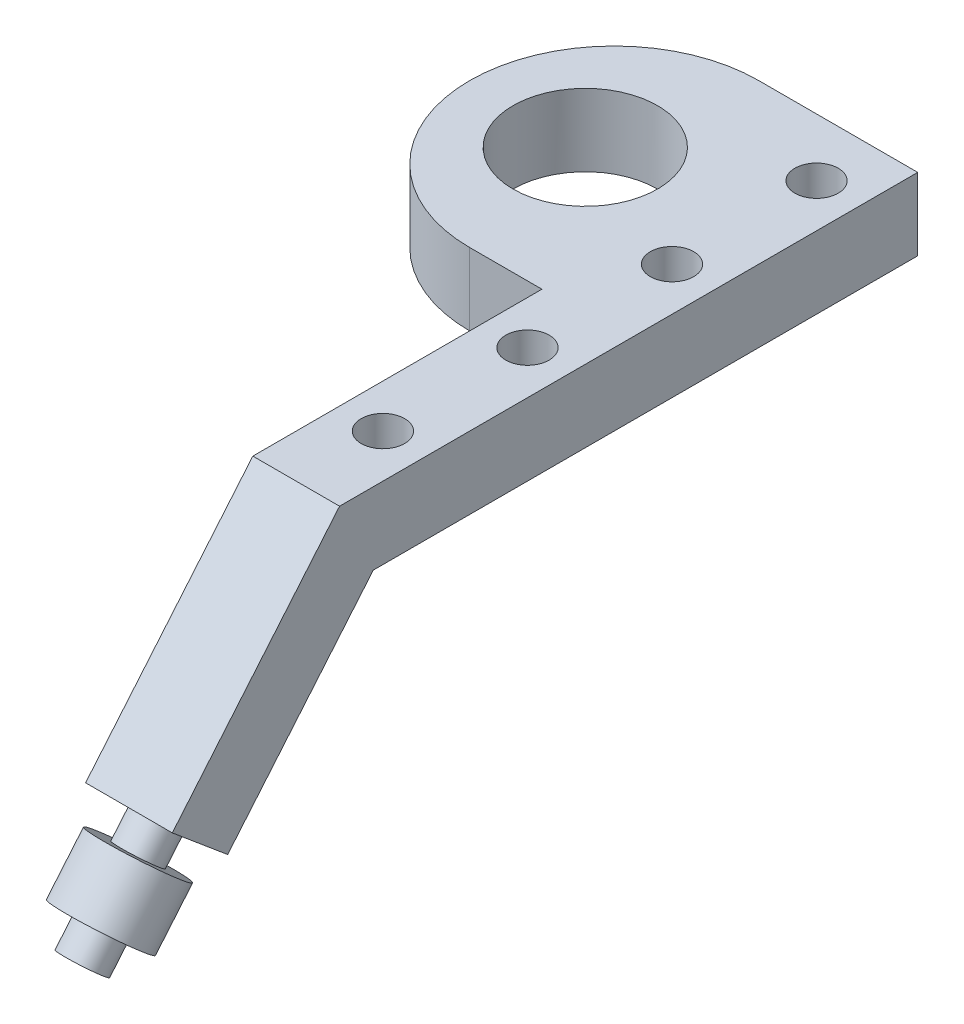
ISO-10303-21;
HEADER;
FILE_DESCRIPTION(('STEP AP214'),'2;1');
FILE_NAME('part.step','',(''),(''),'','','');
FILE_SCHEMA(('AUTOMOTIVE_DESIGN { 1 0 10303 214 1 1 1 1 }'));
ENDSEC;
DATA;
#1=APPLICATION_CONTEXT('core data for automotive mechanical design processes');
#2=APPLICATION_PROTOCOL_DEFINITION('international standard','automotive_design',2000,#1);
#3=PRODUCT_CONTEXT('',#1,'mechanical');
#4=PRODUCT('Part','Part','',(#3));
#5=PRODUCT_RELATED_PRODUCT_CATEGORY('part','',(#4));
#6=PRODUCT_DEFINITION_FORMATION('','',#4);
#7=PRODUCT_DEFINITION_CONTEXT('part definition',#1,'design');
#8=PRODUCT_DEFINITION('design','',#6,#7);
#9=PRODUCT_DEFINITION_SHAPE('','',#8);
#10=(LENGTH_UNIT() NAMED_UNIT(*) SI_UNIT(.MILLI.,.METRE.));
#11=(NAMED_UNIT(*) PLANE_ANGLE_UNIT() SI_UNIT($,.RADIAN.));
#12=(NAMED_UNIT(*) SI_UNIT($,.STERADIAN.) SOLID_ANGLE_UNIT());
#13=UNCERTAINTY_MEASURE_WITH_UNIT(LENGTH_MEASURE(1.E-05),#10,'distance_accuracy_value','');
#14=(GEOMETRIC_REPRESENTATION_CONTEXT(3) GLOBAL_UNCERTAINTY_ASSIGNED_CONTEXT((#13)) GLOBAL_UNIT_ASSIGNED_CONTEXT((#10,
#11,#12)) REPRESENTATION_CONTEXT('',''));
#15=CARTESIAN_POINT('',(0.,0.,0.));
#16=DIRECTION('',(0.,0.,1.));
#17=DIRECTION('',(1.,0.,0.));
#18=AXIS2_PLACEMENT_3D('',#15,#16,#17);
#19=CARTESIAN_POINT('',(0.,5.,0.));
#20=DIRECTION('',(1.,0.,0.));
#21=DIRECTION('',(0.,0.,-1.));
#22=AXIS2_PLACEMENT_3D('',#19,#20,#21);
#23=PLANE('',#22);
#24=DIRECTION('',(0.,1.,0.));
#25=VECTOR('',#24,1.);
#26=CARTESIAN_POINT('',(0.,5.,-20.));
#27=LINE('',#26,#25);
#28=CARTESIAN_POINT('',(0.,0.,-20.));
#29=VERTEX_POINT('',#28);
#30=CARTESIAN_POINT('',(0.,5.,-20.));
#31=VERTEX_POINT('',#30);
#32=EDGE_CURVE('E112',#29,#31,#27,.T.);
#33=ORIENTED_EDGE('',*,*,#32,.F.);
#34=DIRECTION('',(0.,0.,1.));
#35=VECTOR('',#34,1.);
#36=CARTESIAN_POINT('',(0.,0.,0.));
#37=LINE('',#36,#35);
#38=CARTESIAN_POINT('',(0.,0.,-2.33153829077497));
#39=VERTEX_POINT('',#38);
#40=EDGE_CURVE('E187',#29,#39,#37,.T.);
#41=ORIENTED_EDGE('',*,*,#40,.T.);
#42=DIRECTION('',(0.,0.766044443118975,-0.642787609686543));
#43=VECTOR('',#42,1.);
#44=CARTESIAN_POINT('',(0.,-12.0027380245743,7.7399547587629));
#45=LINE('',#44,#43);
#46=CARTESIAN_POINT('',(0.,-12.0027380245743,7.7399547587629));
#47=VERTEX_POINT('',#46);
#48=EDGE_CURVE('E146',#47,#39,#45,.T.);
#49=ORIENTED_EDGE('',*,*,#48,.F.);
#50=DIRECTION('',(0.,-0.642787609686543,-0.766044443118975));
#51=VECTOR('',#50,1.);
#52=CARTESIAN_POINT('',(0.,-8.78879997614155,11.5701769743578));
#53=LINE('',#52,#51);
#54=CARTESIAN_POINT('',(0.,-8.78879997614155,11.5701769743578));
#55=VERTEX_POINT('',#54);
#56=EDGE_CURVE('E153',#55,#47,#53,.T.);
#57=ORIENTED_EDGE('',*,*,#56,.F.);
#58=DIRECTION('',(0.,-0.766044443118975,0.642787609686543));
#59=VECTOR('',#58,1.);
#60=CARTESIAN_POINT('',(0.,5.,0.));
#61=LINE('',#60,#59);
#62=CARTESIAN_POINT('',(0.,5.,0.));
#63=VERTEX_POINT('',#62);
#64=EDGE_CURVE('E119',#63,#55,#61,.T.);
#65=ORIENTED_EDGE('',*,*,#64,.F.);
#66=DIRECTION('',(0.,0.,1.));
#67=VECTOR('',#66,1.);
#68=CARTESIAN_POINT('',(0.,5.,0.));
#69=LINE('',#68,#67);
#70=EDGE_CURVE('E106',#31,#63,#69,.T.);
#71=ORIENTED_EDGE('',*,*,#70,.F.);
#72=EDGE_LOOP('',(#33,#41,#49,#57,#65,#71));
#73=FACE_BOUND('',#72,.T.);
#74=ADVANCED_FACE('F36',(#73),#23,.F.);
#75=CARTESIAN_POINT('',(6.,-8.78879997614155,11.5701769743578));
#76=DIRECTION('',(0.,0.766044443118975,-0.642787609686543));
#77=DIRECTION('',(0.,0.642787609686543,0.766044443118975));
#78=AXIS2_PLACEMENT_3D('',#75,#76,#77);
#79=PLANE('',#78);
#80=ORIENTED_EDGE('',*,*,#56,.T.);
#81=DIRECTION('',(-1.,0.,0.));
#82=VECTOR('',#81,1.);
#83=CARTESIAN_POINT('',(6.,-12.0027380245743,7.7399547587629));
#84=LINE('',#83,#82);
#85=CARTESIAN_POINT('',(6.,-12.0027380245743,7.7399547587629));
#86=VERTEX_POINT('',#85);
#87=EDGE_CURVE('E151',#86,#47,#84,.T.);
#88=ORIENTED_EDGE('',*,*,#87,.F.);
#89=DIRECTION('',(0.,-0.642787609686543,-0.766044443118975));
#90=VECTOR('',#89,1.);
#91=CARTESIAN_POINT('',(6.,-8.78879997614155,11.5701769743578));
#92=LINE('',#91,#90);
#93=CARTESIAN_POINT('',(6.,-8.78879997614155,11.5701769743578));
#94=VERTEX_POINT('',#93);
#95=EDGE_CURVE('E145',#94,#86,#92,.T.);
#96=ORIENTED_EDGE('',*,*,#95,.F.);
#97=DIRECTION('',(-1.,0.,0.));
#98=VECTOR('',#97,1.);
#99=CARTESIAN_POINT('',(6.,-8.78879997614155,11.5701769743578));
#100=LINE('',#99,#98);
#101=EDGE_CURVE('E159',#94,#55,#100,.T.);
#102=ORIENTED_EDGE('',*,*,#101,.T.);
#103=EDGE_LOOP('',(#80,#88,#96,#102));
#104=FACE_BOUND('',#103,.T.);
#105=CARTESIAN_POINT('',(3.,-10.3957690003579,9.65506586656035));
#106=DIRECTION('',(0.,0.766044443118975,-0.642787609686543));
#107=DIRECTION('',(0.,0.642787609686543,0.766044443118975));
#108=AXIS2_PLACEMENT_3D('',#105,#106,#107);
#109=CIRCLE('',#108,1.5);
#110=CARTESIAN_POINT('',(3.,-9.43158758582809,10.8041325312388));
#111=VERTEX_POINT('',#110);
#112=EDGE_CURVE('E202',#111,#111,#109,.F.);
#113=ORIENTED_EDGE('',*,*,#112,.F.);
#114=EDGE_LOOP('',(#113));
#115=FACE_BOUND('',#114,.T.);
#116=ADVANCED_FACE('F270',(#104,#115),#79,.F.);
#117=CARTESIAN_POINT('',(0.,0.,0.));
#118=DIRECTION('',(0.,-1.,0.));
#119=DIRECTION('',(0.,0.,-1.));
#120=AXIS2_PLACEMENT_3D('',#117,#118,#119);
#121=PLANE('',#120);
#122=CARTESIAN_POINT('',(-7.,0.,-30.));
#123=DIRECTION('',(0.,-1.,0.));
#124=DIRECTION('',(0.,0.,-1.));
#125=AXIS2_PLACEMENT_3D('',#122,#123,#124);
#126=CIRCLE('',#125,5.);
#127=CARTESIAN_POINT('',(-7.,0.,-35.));
#128=VERTEX_POINT('',#127);
#129=EDGE_CURVE('E128',#128,#128,#126,.F.);
#130=ORIENTED_EDGE('',*,*,#129,.T.);
#131=EDGE_LOOP('',(#130));
#132=FACE_BOUND('',#131,.T.);
#133=CARTESIAN_POINT('',(3.,0.,-36.));
#134=DIRECTION('',(0.,1.,0.));
#135=DIRECTION('',(0.,0.,1.));
#136=AXIS2_PLACEMENT_3D('',#133,#134,#135);
#137=CIRCLE('',#136,1.5);
#138=CARTESIAN_POINT('',(3.,0.,-34.5));
#139=VERTEX_POINT('',#138);
#140=EDGE_CURVE('E168',#139,#139,#137,.T.);
#141=ORIENTED_EDGE('',*,*,#140,.T.);
#142=EDGE_LOOP('',(#141));
#143=FACE_BOUND('',#142,.T.);
#144=CARTESIAN_POINT('',(3.,0.,-16.));
#145=DIRECTION('',(0.,1.,0.));
#146=DIRECTION('',(0.,0.,1.));
#147=AXIS2_PLACEMENT_3D('',#144,#145,#146);
#148=CIRCLE('',#147,1.5);
#149=CARTESIAN_POINT('',(3.,0.,-14.5));
#150=VERTEX_POINT('',#149);
#151=EDGE_CURVE('E180',#150,#150,#148,.T.);
#152=ORIENTED_EDGE('',*,*,#151,.T.);
#153=EDGE_LOOP('',(#152));
#154=FACE_BOUND('',#153,.T.);
#155=CARTESIAN_POINT('',(3.,0.,-6.));
#156=DIRECTION('',(0.,1.,0.));
#157=DIRECTION('',(0.,0.,1.));
#158=AXIS2_PLACEMENT_3D('',#155,#156,#157);
#159=CIRCLE('',#158,1.5);
#160=CARTESIAN_POINT('',(3.,0.,-4.5));
#161=VERTEX_POINT('',#160);
#162=EDGE_CURVE('E183',#161,#161,#159,.T.);
#163=ORIENTED_EDGE('',*,*,#162,.T.);
#164=EDGE_LOOP('',(#163));
#165=FACE_BOUND('',#164,.T.);
#166=CARTESIAN_POINT('',(3.,0.,-26.));
#167=DIRECTION('',(0.,1.,0.));
#168=DIRECTION('',(0.,0.,1.));
#169=AXIS2_PLACEMENT_3D('',#166,#167,#168);
#170=CIRCLE('',#169,1.5);
#171=CARTESIAN_POINT('',(3.,0.,-24.5));
#172=VERTEX_POINT('',#171);
#173=EDGE_CURVE('E174',#172,#172,#170,.T.);
#174=ORIENTED_EDGE('',*,*,#173,.T.);
#175=EDGE_LOOP('',(#174));
#176=FACE_BOUND('',#175,.T.);
#177=CARTESIAN_POINT('',(-5.,0.,-30.));
#178=DIRECTION('',(0.,-1.,0.));
#179=DIRECTION('',(0.,0.,-1.));
#180=AXIS2_PLACEMENT_3D('',#177,#178,#179);
#181=CIRCLE('',#180,10.);
#182=CARTESIAN_POINT('',(-5.,0.,-20.));
#183=VERTEX_POINT('',#182);
#184=CARTESIAN_POINT('',(-15.,0.,-30.));
#185=VERTEX_POINT('',#184);
#186=EDGE_CURVE('E205',#183,#185,#181,.T.);
#187=ORIENTED_EDGE('',*,*,#186,.T.);
#188=CARTESIAN_POINT('',(-5.,0.,-30.));
#189=DIRECTION('',(0.,-1.,0.));
#190=DIRECTION('',(0.,0.,-1.));
#191=AXIS2_PLACEMENT_3D('',#188,#189,#190);
#192=CIRCLE('',#191,10.);
#193=CARTESIAN_POINT('',(-5.,0.,-40.));
#194=VERTEX_POINT('',#193);
#195=EDGE_CURVE('E223',#185,#194,#192,.T.);
#196=ORIENTED_EDGE('',*,*,#195,.T.);
#197=DIRECTION('',(-1.,0.,0.));
#198=VECTOR('',#197,1.);
#199=CARTESIAN_POINT('',(0.,0.,-40.));
#200=LINE('',#199,#198);
#201=CARTESIAN_POINT('',(6.,0.,-40.));
#202=VERTEX_POINT('',#201);
#203=EDGE_CURVE('E121',#202,#194,#200,.T.);
#204=ORIENTED_EDGE('',*,*,#203,.F.);
#205=DIRECTION('',(0.,0.,-1.));
#206=VECTOR('',#205,1.);
#207=CARTESIAN_POINT('',(6.,0.,0.));
#208=LINE('',#207,#206);
#209=CARTESIAN_POINT('',(6.,0.,-2.33153829077497));
#210=VERTEX_POINT('',#209);
#211=EDGE_CURVE('E199',#210,#202,#208,.T.);
#212=ORIENTED_EDGE('',*,*,#211,.F.);
#213=DIRECTION('',(-1.,0.,0.));
#214=VECTOR('',#213,1.);
#215=CARTESIAN_POINT('',(0.,0.,-2.33153829077497));
#216=LINE('',#215,#214);
#217=EDGE_CURVE('E162',#210,#39,#216,.T.);
#218=ORIENTED_EDGE('',*,*,#217,.T.);
#219=ORIENTED_EDGE('',*,*,#40,.F.);
#220=DIRECTION('',(1.,0.,0.));
#221=VECTOR('',#220,1.);
#222=CARTESIAN_POINT('',(-15.,0.,-20.));
#223=LINE('',#222,#221);
#224=EDGE_CURVE('E111',#183,#29,#223,.T.);
#225=ORIENTED_EDGE('',*,*,#224,.F.);
#226=EDGE_LOOP('',(#187,#196,#204,#212,#218,#219,#225));
#227=FACE_BOUND('',#226,.T.);
#228=ADVANCED_FACE('F221',(#132,#143,#154,#165,#176,#227),#121,.T.);
#229=CARTESIAN_POINT('',(0.,5.,0.));
#230=DIRECTION('',(0.,-1.,0.));
#231=DIRECTION('',(0.,0.,-1.));
#232=AXIS2_PLACEMENT_3D('',#229,#230,#231);
#233=PLANE('',#232);
#234=CARTESIAN_POINT('',(-7.,5.,-30.));
#235=DIRECTION('',(0.,1.,0.));
#236=DIRECTION('',(0.,0.,1.));
#237=AXIS2_PLACEMENT_3D('',#234,#235,#236);
#238=CIRCLE('',#237,5.);
#239=CARTESIAN_POINT('',(-7.,5.,-25.));
#240=VERTEX_POINT('',#239);
#241=EDGE_CURVE('E125',#240,#240,#238,.T.);
#242=ORIENTED_EDGE('',*,*,#241,.F.);
#243=EDGE_LOOP('',(#242));
#244=FACE_BOUND('',#243,.T.);
#245=CARTESIAN_POINT('',(3.,5.,-26.));
#246=DIRECTION('',(0.,1.,0.));
#247=DIRECTION('',(0.,0.,1.));
#248=AXIS2_PLACEMENT_3D('',#245,#246,#247);
#249=CIRCLE('',#248,1.5);
#250=CARTESIAN_POINT('',(3.,5.,-24.5));
#251=VERTEX_POINT('',#250);
#252=EDGE_CURVE('E171',#251,#251,#249,.T.);
#253=ORIENTED_EDGE('',*,*,#252,.F.);
#254=EDGE_LOOP('',(#253));
#255=FACE_BOUND('',#254,.T.);
#256=CARTESIAN_POINT('',(3.,5.,-6.));
#257=DIRECTION('',(0.,1.,0.));
#258=DIRECTION('',(0.,0.,1.));
#259=AXIS2_PLACEMENT_3D('',#256,#257,#258);
#260=CIRCLE('',#259,1.5);
#261=CARTESIAN_POINT('',(3.,5.,-4.5));
#262=VERTEX_POINT('',#261);
#263=EDGE_CURVE('E184',#262,#262,#260,.T.);
#264=ORIENTED_EDGE('',*,*,#263,.F.);
#265=EDGE_LOOP('',(#264));
#266=FACE_BOUND('',#265,.T.);
#267=DIRECTION('',(-1.,0.,0.));
#268=VECTOR('',#267,1.);
#269=CARTESIAN_POINT('',(0.,5.,-40.));
#270=LINE('',#269,#268);
#271=CARTESIAN_POINT('',(6.,5.,-40.));
#272=VERTEX_POINT('',#271);
#273=CARTESIAN_POINT('',(-5.,5.,-40.));
#274=VERTEX_POINT('',#273);
#275=EDGE_CURVE('E194',#272,#274,#270,.T.);
#276=ORIENTED_EDGE('',*,*,#275,.T.);
#277=CARTESIAN_POINT('',(-5.,5.,-30.));
#278=DIRECTION('',(0.,-1.,0.));
#279=DIRECTION('',(0.,0.,-1.));
#280=AXIS2_PLACEMENT_3D('',#277,#278,#279);
#281=CIRCLE('',#280,10.);
#282=CARTESIAN_POINT('',(-15.,5.,-30.));
#283=VERTEX_POINT('',#282);
#284=EDGE_CURVE('E56',#274,#283,#281,.F.);
#285=ORIENTED_EDGE('',*,*,#284,.T.);
#286=CARTESIAN_POINT('',(-5.,5.,-30.));
#287=DIRECTION('',(0.,-1.,0.));
#288=DIRECTION('',(0.,0.,-1.));
#289=AXIS2_PLACEMENT_3D('',#286,#287,#288);
#290=CIRCLE('',#289,10.);
#291=CARTESIAN_POINT('',(-5.,5.,-20.));
#292=VERTEX_POINT('',#291);
#293=EDGE_CURVE('E51',#283,#292,#290,.F.);
#294=ORIENTED_EDGE('',*,*,#293,.T.);
#295=DIRECTION('',(1.,0.,0.));
#296=VECTOR('',#295,1.);
#297=CARTESIAN_POINT('',(-15.,5.,-20.));
#298=LINE('',#297,#296);
#299=EDGE_CURVE('E102',#292,#31,#298,.T.);
#300=ORIENTED_EDGE('',*,*,#299,.T.);
#301=ORIENTED_EDGE('',*,*,#70,.T.);
#302=DIRECTION('',(1.,0.,0.));
#303=VECTOR('',#302,1.);
#304=CARTESIAN_POINT('',(0.,5.,0.));
#305=LINE('',#304,#303);
#306=CARTESIAN_POINT('',(6.,5.,0.));
#307=VERTEX_POINT('',#306);
#308=EDGE_CURVE('E120',#63,#307,#305,.T.);
#309=ORIENTED_EDGE('',*,*,#308,.T.);
#310=DIRECTION('',(0.,0.,-1.));
#311=VECTOR('',#310,1.);
#312=CARTESIAN_POINT('',(6.,5.,0.));
#313=LINE('',#312,#311);
#314=EDGE_CURVE('E192',#307,#272,#313,.T.);
#315=ORIENTED_EDGE('',*,*,#314,.T.);
#316=EDGE_LOOP('',(#276,#285,#294,#300,#301,#309,#315));
#317=FACE_BOUND('',#316,.T.);
#318=CARTESIAN_POINT('',(3.,5.,-16.));
#319=DIRECTION('',(0.,1.,0.));
#320=DIRECTION('',(0.,0.,1.));
#321=AXIS2_PLACEMENT_3D('',#318,#319,#320);
#322=CIRCLE('',#321,1.5);
#323=CARTESIAN_POINT('',(3.,5.,-14.5));
#324=VERTEX_POINT('',#323);
#325=EDGE_CURVE('E177',#324,#324,#322,.T.);
#326=ORIENTED_EDGE('',*,*,#325,.F.);
#327=EDGE_LOOP('',(#326));
#328=FACE_BOUND('',#327,.T.);
#329=CARTESIAN_POINT('',(3.,5.,-36.));
#330=DIRECTION('',(0.,1.,0.));
#331=DIRECTION('',(0.,0.,1.));
#332=AXIS2_PLACEMENT_3D('',#329,#330,#331);
#333=CIRCLE('',#332,1.5);
#334=CARTESIAN_POINT('',(3.,5.,-34.5));
#335=VERTEX_POINT('',#334);
#336=EDGE_CURVE('E165',#335,#335,#333,.T.);
#337=ORIENTED_EDGE('',*,*,#336,.F.);
#338=EDGE_LOOP('',(#337));
#339=FACE_BOUND('',#338,.T.);
#340=ADVANCED_FACE('F104',(#244,#255,#266,#317,#328,#339),#233,.F.);
#341=CARTESIAN_POINT('',(6.,5.,0.));
#342=DIRECTION('',(-1.,0.,0.));
#343=DIRECTION('',(0.,0.,1.));
#344=AXIS2_PLACEMENT_3D('',#341,#342,#343);
#345=PLANE('',#344);
#346=DIRECTION('',(0.,0.766044443118975,-0.642787609686543));
#347=VECTOR('',#346,1.);
#348=CARTESIAN_POINT('',(6.,-12.0027380245743,7.7399547587629));
#349=LINE('',#348,#347);
#350=EDGE_CURVE('E148',#86,#210,#349,.T.);
#351=ORIENTED_EDGE('',*,*,#350,.T.);
#352=ORIENTED_EDGE('',*,*,#211,.T.);
#353=DIRECTION('',(0.,-1.,0.));
#354=VECTOR('',#353,1.);
#355=CARTESIAN_POINT('',(6.,5.,-40.));
#356=LINE('',#355,#354);
#357=EDGE_CURVE('E196',#272,#202,#356,.T.);
#358=ORIENTED_EDGE('',*,*,#357,.F.);
#359=ORIENTED_EDGE('',*,*,#314,.F.);
#360=DIRECTION('',(0.,-0.766044443118975,0.642787609686543));
#361=VECTOR('',#360,1.);
#362=CARTESIAN_POINT('',(6.,5.,0.));
#363=LINE('',#362,#361);
#364=EDGE_CURVE('E142',#307,#94,#363,.T.);
#365=ORIENTED_EDGE('',*,*,#364,.T.);
#366=ORIENTED_EDGE('',*,*,#95,.T.);
#367=EDGE_LOOP('',(#351,#352,#358,#359,#365,#366));
#368=FACE_BOUND('',#367,.T.);
#369=ADVANCED_FACE('F214',(#368),#345,.F.);
#370=CARTESIAN_POINT('',(0.,5.,-40.));
#371=DIRECTION('',(0.,0.,1.));
#372=DIRECTION('',(1.,0.,0.));
#373=AXIS2_PLACEMENT_3D('',#370,#371,#372);
#374=PLANE('',#373);
#375=ORIENTED_EDGE('',*,*,#203,.T.);
#376=DIRECTION('',(0.,-1.,0.));
#377=VECTOR('',#376,1.);
#378=CARTESIAN_POINT('',(-5.,5.,-40.));
#379=LINE('',#378,#377);
#380=EDGE_CURVE('E228',#194,#274,#379,.F.);
#381=ORIENTED_EDGE('',*,*,#380,.T.);
#382=ORIENTED_EDGE('',*,*,#275,.F.);
#383=ORIENTED_EDGE('',*,*,#357,.T.);
#384=EDGE_LOOP('',(#375,#381,#382,#383));
#385=FACE_BOUND('',#384,.T.);
#386=ADVANCED_FACE('F220',(#385),#374,.F.);
#387=CARTESIAN_POINT('',(3.,5.,-6.));
#388=DIRECTION('',(0.,-1.,0.));
#389=DIRECTION('',(0.,0.,-1.));
#390=AXIS2_PLACEMENT_3D('',#387,#388,#389);
#391=CYLINDRICAL_SURFACE('',#390,1.5);
#392=ORIENTED_EDGE('',*,*,#263,.T.);
#393=EDGE_LOOP('',(#392));
#394=FACE_BOUND('',#393,.T.);
#395=ORIENTED_EDGE('',*,*,#162,.F.);
#396=EDGE_LOOP('',(#395));
#397=FACE_BOUND('',#396,.T.);
#398=ADVANCED_FACE('F319',(#394,#397),#391,.F.);
#399=CARTESIAN_POINT('',(3.,5.,-16.));
#400=DIRECTION('',(0.,-1.,0.));
#401=DIRECTION('',(0.,0.,-1.));
#402=AXIS2_PLACEMENT_3D('',#399,#400,#401);
#403=CYLINDRICAL_SURFACE('',#402,1.5);
#404=ORIENTED_EDGE('',*,*,#325,.T.);
#405=EDGE_LOOP('',(#404));
#406=FACE_BOUND('',#405,.T.);
#407=ORIENTED_EDGE('',*,*,#151,.F.);
#408=EDGE_LOOP('',(#407));
#409=FACE_BOUND('',#408,.T.);
#410=ADVANCED_FACE('F315',(#406,#409),#403,.F.);
#411=CARTESIAN_POINT('',(3.,5.,-26.));
#412=DIRECTION('',(0.,-1.,0.));
#413=DIRECTION('',(0.,0.,-1.));
#414=AXIS2_PLACEMENT_3D('',#411,#412,#413);
#415=CYLINDRICAL_SURFACE('',#414,1.5);
#416=ORIENTED_EDGE('',*,*,#252,.T.);
#417=EDGE_LOOP('',(#416));
#418=FACE_BOUND('',#417,.T.);
#419=ORIENTED_EDGE('',*,*,#173,.F.);
#420=EDGE_LOOP('',(#419));
#421=FACE_BOUND('',#420,.T.);
#422=ADVANCED_FACE('F311',(#418,#421),#415,.F.);
#423=CARTESIAN_POINT('',(3.,5.,-36.));
#424=DIRECTION('',(0.,-1.,0.));
#425=DIRECTION('',(0.,0.,-1.));
#426=AXIS2_PLACEMENT_3D('',#423,#424,#425);
#427=CYLINDRICAL_SURFACE('',#426,1.5);
#428=ORIENTED_EDGE('',*,*,#336,.T.);
#429=EDGE_LOOP('',(#428));
#430=FACE_BOUND('',#429,.T.);
#431=ORIENTED_EDGE('',*,*,#140,.F.);
#432=EDGE_LOOP('',(#431));
#433=FACE_BOUND('',#432,.T.);
#434=ADVANCED_FACE('F306',(#430,#433),#427,.F.);
#435=CARTESIAN_POINT('',(6.,5.,0.));
#436=DIRECTION('',(0.,-0.642787609686543,-0.766044443118975));
#437=DIRECTION('',(0.,0.766044443118975,-0.642787609686543));
#438=AXIS2_PLACEMENT_3D('',#435,#436,#437);
#439=PLANE('',#438);
#440=ORIENTED_EDGE('',*,*,#64,.T.);
#441=ORIENTED_EDGE('',*,*,#101,.F.);
#442=ORIENTED_EDGE('',*,*,#364,.F.);
#443=ORIENTED_EDGE('',*,*,#308,.F.);
#444=EDGE_LOOP('',(#440,#441,#442,#443));
#445=FACE_BOUND('',#444,.T.);
#446=ADVANCED_FACE('F291',(#445),#439,.F.);
#447=CARTESIAN_POINT('',(6.,-12.0027380245743,7.7399547587629));
#448=DIRECTION('',(0.,0.642787609686543,0.766044443118975));
#449=DIRECTION('',(0.,-0.766044443118975,0.642787609686543));
#450=AXIS2_PLACEMENT_3D('',#447,#448,#449);
#451=PLANE('',#450);
#452=ORIENTED_EDGE('',*,*,#217,.F.);
#453=ORIENTED_EDGE('',*,*,#350,.F.);
#454=ORIENTED_EDGE('',*,*,#87,.T.);
#455=ORIENTED_EDGE('',*,*,#48,.T.);
#456=EDGE_LOOP('',(#452,#453,#454,#455));
#457=FACE_BOUND('',#456,.T.);
#458=ADVANCED_FACE('F296',(#457),#451,.F.);
#459=CARTESIAN_POINT('',(3.,-16.5241245453097,14.7973667440527));
#460=DIRECTION('',(0.,0.766044443118975,-0.642787609686543));
#461=DIRECTION('',(0.,0.642787609686543,0.766044443118975));
#462=AXIS2_PLACEMENT_3D('',#459,#460,#461);
#463=CYLINDRICAL_SURFACE('',#462,1.5);
#464=CARTESIAN_POINT('',(3.,-11.9278578865959,10.9406410859334));
#465=DIRECTION('',(3.30886706922939E-11,0.76604444277835,-0.642787610092484));
#466=DIRECTION('',(0.,0.642787610092484,0.766044442778351));
#467=AXIS2_PLACEMENT_3D('',#464,#465,#466);
#468=CIRCLE('',#467,1.5);
#469=CARTESIAN_POINT('',(3.,-10.9636764714571,12.089707750101));
#470=VERTEX_POINT('',#469);
#471=EDGE_CURVE('E238',#470,#470,#468,.T.);
#472=ORIENTED_EDGE('',*,*,#471,.T.);
#473=EDGE_LOOP('',(#472));
#474=FACE_BOUND('',#473,.T.);
#475=ORIENTED_EDGE('',*,*,#112,.T.);
#476=EDGE_LOOP('',(#475));
#477=FACE_BOUND('',#476,.T.);
#478=ADVANCED_FACE('F299',(#474,#477),#463,.T.);
#479=CARTESIAN_POINT('',(-15.,5.,-20.));
#480=DIRECTION('',(0.,0.,-1.));
#481=DIRECTION('',(-1.,0.,0.));
#482=AXIS2_PLACEMENT_3D('',#479,#480,#481);
#483=PLANE('',#482);
#484=ORIENTED_EDGE('',*,*,#299,.F.);
#485=DIRECTION('',(0.,1.,0.));
#486=VECTOR('',#485,1.);
#487=CARTESIAN_POINT('',(-5.,0.,-20.));
#488=LINE('',#487,#486);
#489=EDGE_CURVE('E44',#292,#183,#488,.F.);
#490=ORIENTED_EDGE('',*,*,#489,.T.);
#491=ORIENTED_EDGE('',*,*,#224,.T.);
#492=ORIENTED_EDGE('',*,*,#32,.T.);
#493=EDGE_LOOP('',(#484,#490,#491,#492));
#494=FACE_BOUND('',#493,.T.);
#495=ADVANCED_FACE('F123',(#494),#483,.F.);
#496=CARTESIAN_POINT('',(-7.,-17.4893059598395,-30.));
#497=DIRECTION('',(0.,1.,0.));
#498=DIRECTION('',(0.,0.,1.));
#499=AXIS2_PLACEMENT_3D('',#496,#497,#498);
#500=CYLINDRICAL_SURFACE('',#499,5.);
#501=ORIENTED_EDGE('',*,*,#129,.F.);
#502=EDGE_LOOP('',(#501));
#503=FACE_BOUND('',#502,.T.);
#504=ORIENTED_EDGE('',*,*,#241,.T.);
#505=EDGE_LOOP('',(#504));
#506=FACE_BOUND('',#505,.T.);
#507=ADVANCED_FACE('F286',(#503,#506),#500,.F.);
#508=CARTESIAN_POINT('',(-5.,0.,-30.));
#509=DIRECTION('',(0.,-1.,0.));
#510=DIRECTION('',(0.,0.,-1.));
#511=AXIS2_PLACEMENT_3D('',#508,#509,#510);
#512=CYLINDRICAL_SURFACE('',#511,10.);
#513=ORIENTED_EDGE('',*,*,#489,.F.);
#514=ORIENTED_EDGE('',*,*,#293,.F.);
#515=DIRECTION('',(0.,1.,0.));
#516=VECTOR('',#515,1.);
#517=CARTESIAN_POINT('',(-15.,5.,-30.));
#518=LINE('',#517,#516);
#519=EDGE_CURVE('E237',#185,#283,#518,.T.);
#520=ORIENTED_EDGE('',*,*,#519,.F.);
#521=ORIENTED_EDGE('',*,*,#186,.F.);
#522=EDGE_LOOP('',(#513,#514,#520,#521));
#523=FACE_BOUND('',#522,.T.);
#524=ADVANCED_FACE('F38',(#523),#512,.T.);
#525=CARTESIAN_POINT('',(-5.,0.,-30.));
#526=DIRECTION('',(0.,1.,0.));
#527=DIRECTION('',(0.,0.,1.));
#528=AXIS2_PLACEMENT_3D('',#525,#526,#527);
#529=CYLINDRICAL_SURFACE('',#528,10.);
#530=ORIENTED_EDGE('',*,*,#284,.F.);
#531=ORIENTED_EDGE('',*,*,#380,.F.);
#532=ORIENTED_EDGE('',*,*,#195,.F.);
#533=ORIENTED_EDGE('',*,*,#519,.T.);
#534=EDGE_LOOP('',(#530,#531,#532,#533));
#535=FACE_BOUND('',#534,.T.);
#536=ADVANCED_FACE('F279',(#535),#529,.T.);
#537=CARTESIAN_POINT('',(-6.67391135054161E-10,-15.4509461840316,12.9648832583136));
#538=DIRECTION('',(3.30886706922939E-11,0.76604444277835,-0.642787610092484));
#539=DIRECTION('',(0.,0.642787610092484,0.766044442778351));
#540=AXIS2_PLACEMENT_3D('',#537,#538,#539);
#541=PLANE('',#540);
#542=CARTESIAN_POINT('',(3.,-14.9920356590718,13.5117915246796));
#543=DIRECTION('',(0.,-0.766044443118975,0.642787609686543));
#544=DIRECTION('',(0.,-0.642787609686543,-0.766044443118975));
#545=AXIS2_PLACEMENT_3D('',#542,#543,#544);
#546=CIRCLE('',#545,3.);
#547=CARTESIAN_POINT('',(3.,-16.9203984881314,11.2136581953227));
#548=VERTEX_POINT('',#547);
#549=EDGE_CURVE('E244',#548,#548,#546,.T.);
#550=ORIENTED_EDGE('',*,*,#549,.T.);
#551=EDGE_LOOP('',(#550));
#552=FACE_BOUND('',#551,.T.);
#553=CARTESIAN_POINT('',(3.,-14.9920356590718,13.5117915246796));
#554=DIRECTION('',(3.30886706922939E-11,0.76604444277835,-0.642787610092484));
#555=DIRECTION('',(0.,0.642787610092484,0.766044442778351));
#556=AXIS2_PLACEMENT_3D('',#553,#554,#555);
#557=CIRCLE('',#556,1.5);
#558=CARTESIAN_POINT('',(3.,-14.027854243933,14.6608581888471));
#559=VERTEX_POINT('',#558);
#560=EDGE_CURVE('E12',#559,#559,#557,.T.);
#561=ORIENTED_EDGE('',*,*,#560,.T.);
#562=EDGE_LOOP('',(#561));
#563=FACE_BOUND('',#562,.T.);
#564=ADVANCED_FACE('F252',(#552,#563),#541,.F.);
#565=CARTESIAN_POINT('',(-6.67391135054161E-10,-12.3867684115557,10.3937328195675));
#566=DIRECTION('',(3.30886706922939E-11,0.76604444277835,-0.642787610092484));
#567=DIRECTION('',(0.,0.642787610092484,0.766044442778351));
#568=AXIS2_PLACEMENT_3D('',#565,#566,#567);
#569=PLANE('',#568);
#570=CARTESIAN_POINT('',(3.,-11.9278578865959,10.9406410859334));
#571=DIRECTION('',(0.,-0.766044443118975,0.642787609686543));
#572=DIRECTION('',(0.,-0.642787609686543,-0.766044443118975));
#573=AXIS2_PLACEMENT_3D('',#570,#571,#572);
#574=CIRCLE('',#573,3.);
#575=CARTESIAN_POINT('',(3.,-13.8562207156555,8.64250775657651));
#576=VERTEX_POINT('',#575);
#577=EDGE_CURVE('E240',#576,#576,#574,.T.);
#578=ORIENTED_EDGE('',*,*,#577,.F.);
#579=EDGE_LOOP('',(#578));
#580=FACE_BOUND('',#579,.T.);
#581=ORIENTED_EDGE('',*,*,#471,.F.);
#582=EDGE_LOOP('',(#581));
#583=FACE_BOUND('',#582,.T.);
#584=ADVANCED_FACE('F258',(#580,#583),#569,.T.);
#585=CARTESIAN_POINT('',(3.,-14.9920356590718,13.5117915246796));
#586=DIRECTION('',(0.,0.766044443118975,-0.642787609686543));
#587=DIRECTION('',(0.,0.642787609686543,0.766044443118975));
#588=AXIS2_PLACEMENT_3D('',#585,#586,#587);
#589=CYLINDRICAL_SURFACE('',#588,3.);
#590=ORIENTED_EDGE('',*,*,#549,.F.);
#591=EDGE_LOOP('',(#590));
#592=FACE_BOUND('',#591,.T.);
#593=ORIENTED_EDGE('',*,*,#577,.T.);
#594=EDGE_LOOP('',(#593));
#595=FACE_BOUND('',#594,.T.);
#596=ADVANCED_FACE('F255',(#592,#595),#589,.T.);
#597=CARTESIAN_POINT('',(3.,-16.5241245453097,14.7973667440527));
#598=DIRECTION('',(0.,-0.766044443118975,0.642787609686543));
#599=DIRECTION('',(0.,-0.642787609686543,-0.766044443118975));
#600=AXIS2_PLACEMENT_3D('',#597,#598,#599);
#601=PLANE('',#600);
#602=CARTESIAN_POINT('',(3.,-16.5241245453097,14.7973667440527));
#603=DIRECTION('',(0.,-0.766044443118975,0.642787609686543));
#604=DIRECTION('',(0.,-0.642787609686543,-0.766044443118975));
#605=AXIS2_PLACEMENT_3D('',#602,#603,#604);
#606=CIRCLE('',#605,1.5);
#607=CARTESIAN_POINT('',(3.,-17.4883059598395,13.6483000793742));
#608=VERTEX_POINT('',#607);
#609=EDGE_CURVE('E139',#608,#608,#606,.T.);
#610=ORIENTED_EDGE('',*,*,#609,.T.);
#611=EDGE_LOOP('',(#610));
#612=FACE_BOUND('',#611,.T.);
#613=ADVANCED_FACE('F257',(#612),#601,.T.);
#614=ORIENTED_EDGE('',*,*,#609,.F.);
#615=EDGE_LOOP('',(#614));
#616=FACE_BOUND('',#615,.T.);
#617=ORIENTED_EDGE('',*,*,#560,.F.);
#618=EDGE_LOOP('',(#617));
#619=FACE_BOUND('',#618,.T.);
#620=ADVANCED_FACE('F264',(#616,#619),#463,.T.);
#621=CLOSED_SHELL('',(#74,#116,#228,#340,#369,#386,#398,#410,#422,#434,#446,#458,#478,#495,#507,
#524,#536,#564,#584,#596,#613,#620));
#622=MANIFOLD_SOLID_BREP('B2',#621);
#623=ADVANCED_BREP_SHAPE_REPRESENTATION('',(#18,#622),#14);
#624=SHAPE_DEFINITION_REPRESENTATION(#9,#623);
ENDSEC;
END-ISO-10303-21;
